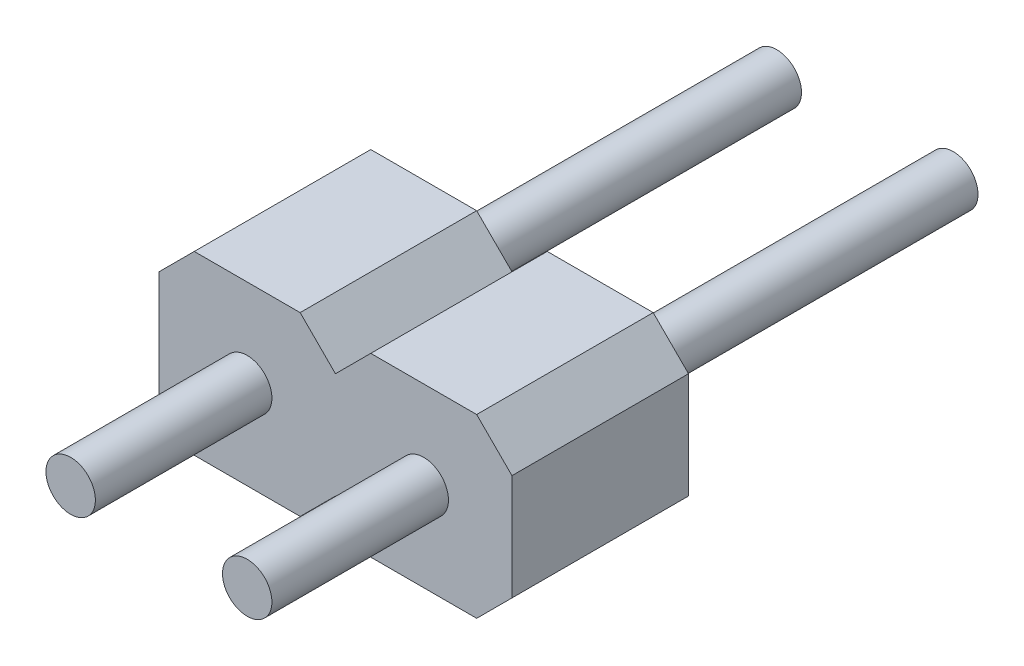
ISO-10303-21;
HEADER;
FILE_DESCRIPTION(('STEP AP214'),'2;1');
FILE_NAME('part.step','',(''),(''),'','','');
FILE_SCHEMA(('AUTOMOTIVE_DESIGN { 1 0 10303 214 1 1 1 1 }'));
ENDSEC;
DATA;
#1=APPLICATION_CONTEXT('core data for automotive mechanical design processes');
#2=APPLICATION_PROTOCOL_DEFINITION('international standard','automotive_design',2000,#1);
#3=PRODUCT_CONTEXT('',#1,'mechanical');
#4=PRODUCT('Part','Part','',(#3));
#5=PRODUCT_RELATED_PRODUCT_CATEGORY('part','',(#4));
#6=PRODUCT_DEFINITION_FORMATION('','',#4);
#7=PRODUCT_DEFINITION_CONTEXT('part definition',#1,'design');
#8=PRODUCT_DEFINITION('design','',#6,#7);
#9=PRODUCT_DEFINITION_SHAPE('','',#8);
#10=(LENGTH_UNIT() NAMED_UNIT(*) SI_UNIT(.MILLI.,.METRE.));
#11=(NAMED_UNIT(*) PLANE_ANGLE_UNIT() SI_UNIT($,.RADIAN.));
#12=(NAMED_UNIT(*) SI_UNIT($,.STERADIAN.) SOLID_ANGLE_UNIT());
#13=UNCERTAINTY_MEASURE_WITH_UNIT(LENGTH_MEASURE(1.E-05),#10,'distance_accuracy_value','');
#14=(GEOMETRIC_REPRESENTATION_CONTEXT(3) GLOBAL_UNCERTAINTY_ASSIGNED_CONTEXT((#13)) GLOBAL_UNIT_ASSIGNED_CONTEXT((#10,
#11,#12)) REPRESENTATION_CONTEXT('',''));
#15=CARTESIAN_POINT('',(0.,0.,0.));
#16=DIRECTION('',(0.,0.,1.));
#17=DIRECTION('',(1.,0.,0.));
#18=AXIS2_PLACEMENT_3D('',#15,#16,#17);
#19=CARTESIAN_POINT('',(11.25,0.75,2.5));
#20=DIRECTION('',(-1.,0.,0.));
#21=DIRECTION('',(0.,0.,1.));
#22=AXIS2_PLACEMENT_3D('',#19,#20,#21);
#23=PLANE('',#22);
#24=DIRECTION('',(0.,0.,1.));
#25=VECTOR('',#24,1.);
#26=CARTESIAN_POINT('',(11.25,0.750000000000001,2.5));
#27=LINE('',#26,#25);
#28=CARTESIAN_POINT('',(11.25,0.75,0.));
#29=VERTEX_POINT('',#28);
#30=CARTESIAN_POINT('',(11.25,0.75,2.5));
#31=VERTEX_POINT('',#30);
#32=EDGE_CURVE('E132',#29,#31,#27,.T.);
#33=ORIENTED_EDGE('',*,*,#32,.T.);
#34=DIRECTION('',(0.,1.,0.));
#35=VECTOR('',#34,1.);
#36=CARTESIAN_POINT('',(11.25,0.75,2.5));
#37=LINE('',#36,#35);
#38=CARTESIAN_POINT('',(11.25,-0.75,2.5));
#39=VERTEX_POINT('',#38);
#40=EDGE_CURVE('E119',#39,#31,#37,.T.);
#41=ORIENTED_EDGE('',*,*,#40,.F.);
#42=DIRECTION('',(0.,0.,1.));
#43=VECTOR('',#42,1.);
#44=CARTESIAN_POINT('',(11.25,-0.750000000000001,2.5));
#45=LINE('',#44,#43);
#46=CARTESIAN_POINT('',(11.25,-0.75,0.));
#47=VERTEX_POINT('',#46);
#48=EDGE_CURVE('E241',#39,#47,#45,.F.);
#49=ORIENTED_EDGE('',*,*,#48,.T.);
#50=DIRECTION('',(0.,1.,0.));
#51=VECTOR('',#50,1.);
#52=CARTESIAN_POINT('',(11.25,0.75,0.));
#53=LINE('',#52,#51);
#54=EDGE_CURVE('E115',#29,#47,#53,.F.);
#55=ORIENTED_EDGE('',*,*,#54,.F.);
#56=EDGE_LOOP('',(#33,#41,#49,#55));
#57=FACE_BOUND('',#56,.T.);
#58=ADVANCED_FACE('F17',(#57),#23,.F.);
#59=CARTESIAN_POINT('',(10.75,1.25,2.5));
#60=DIRECTION('',(-0.707106781186548,-0.707106781186548,0.));
#61=DIRECTION('',(0.707106781186548,-0.707106781186548,0.));
#62=AXIS2_PLACEMENT_3D('',#59,#60,#61);
#63=PLANE('',#62);
#64=DIRECTION('',(0.,0.,-1.));
#65=VECTOR('',#64,1.);
#66=CARTESIAN_POINT('',(10.75,1.25,2.5));
#67=LINE('',#66,#65);
#68=CARTESIAN_POINT('',(10.75,1.25,0.));
#69=VERTEX_POINT('',#68);
#70=CARTESIAN_POINT('',(10.75,1.25,2.5));
#71=VERTEX_POINT('',#70);
#72=EDGE_CURVE('E135',#69,#71,#67,.F.);
#73=ORIENTED_EDGE('',*,*,#72,.T.);
#74=DIRECTION('',(0.707106781186548,-0.707106781186548,0.));
#75=VECTOR('',#74,1.);
#76=CARTESIAN_POINT('',(10.75,1.25,2.5));
#77=LINE('',#76,#75);
#78=EDGE_CURVE('E123',#31,#71,#77,.F.);
#79=ORIENTED_EDGE('',*,*,#78,.F.);
#80=ORIENTED_EDGE('',*,*,#32,.F.);
#81=DIRECTION('',(0.707106781186548,-0.707106781186548,0.));
#82=VECTOR('',#81,1.);
#83=CARTESIAN_POINT('',(10.75,1.25,0.));
#84=LINE('',#83,#82);
#85=EDGE_CURVE('E136',#69,#29,#84,.T.);
#86=ORIENTED_EDGE('',*,*,#85,.F.);
#87=EDGE_LOOP('',(#73,#79,#80,#86));
#88=FACE_BOUND('',#87,.T.);
#89=ADVANCED_FACE('F131',(#88),#63,.F.);
#90=CARTESIAN_POINT('',(10.75,-1.25,2.5));
#91=DIRECTION('',(-0.707106781186548,0.707106781186548,0.));
#92=DIRECTION('',(-0.707106781186548,-0.707106781186548,0.));
#93=AXIS2_PLACEMENT_3D('',#90,#91,#92);
#94=PLANE('',#93);
#95=ORIENTED_EDGE('',*,*,#48,.F.);
#96=DIRECTION('',(-0.707106781186548,-0.707106781186548,0.));
#97=VECTOR('',#96,1.);
#98=CARTESIAN_POINT('',(10.75,-1.25,2.5));
#99=LINE('',#98,#97);
#100=CARTESIAN_POINT('',(10.75,-1.25,2.5));
#101=VERTEX_POINT('',#100);
#102=EDGE_CURVE('E126',#101,#39,#99,.F.);
#103=ORIENTED_EDGE('',*,*,#102,.F.);
#104=DIRECTION('',(0.,0.,1.));
#105=VECTOR('',#104,1.);
#106=CARTESIAN_POINT('',(10.75,-1.25,2.5));
#107=LINE('',#106,#105);
#108=CARTESIAN_POINT('',(10.75,-1.25,0.));
#109=VERTEX_POINT('',#108);
#110=EDGE_CURVE('E228',#101,#109,#107,.F.);
#111=ORIENTED_EDGE('',*,*,#110,.T.);
#112=DIRECTION('',(-0.707106781186548,-0.707106781186548,0.));
#113=VECTOR('',#112,1.);
#114=CARTESIAN_POINT('',(10.75,-1.25,0.));
#115=LINE('',#114,#113);
#116=EDGE_CURVE('E239',#47,#109,#115,.T.);
#117=ORIENTED_EDGE('',*,*,#116,.F.);
#118=EDGE_LOOP('',(#95,#103,#111,#117));
#119=FACE_BOUND('',#118,.T.);
#120=ADVANCED_FACE('F301',(#119),#94,.F.);
#121=CARTESIAN_POINT('',(9.25,1.25,2.5));
#122=DIRECTION('',(0.,-1.,0.));
#123=DIRECTION('',(0.,0.,-1.));
#124=AXIS2_PLACEMENT_3D('',#121,#122,#123);
#125=PLANE('',#124);
#126=DIRECTION('',(0.,0.,1.));
#127=VECTOR('',#126,1.);
#128=CARTESIAN_POINT('',(9.25,1.25,2.5));
#129=LINE('',#128,#127);
#130=CARTESIAN_POINT('',(9.25,1.25,0.));
#131=VERTEX_POINT('',#130);
#132=CARTESIAN_POINT('',(9.25,1.25,2.5));
#133=VERTEX_POINT('',#132);
#134=EDGE_CURVE('E223',#131,#133,#129,.T.);
#135=ORIENTED_EDGE('',*,*,#134,.T.);
#136=DIRECTION('',(1.,0.,0.));
#137=VECTOR('',#136,1.);
#138=CARTESIAN_POINT('',(9.25,1.25,2.5));
#139=LINE('',#138,#137);
#140=EDGE_CURVE('E236',#71,#133,#139,.F.);
#141=ORIENTED_EDGE('',*,*,#140,.F.);
#142=ORIENTED_EDGE('',*,*,#72,.F.);
#143=DIRECTION('',(1.,0.,0.));
#144=VECTOR('',#143,1.);
#145=CARTESIAN_POINT('',(9.25,1.25,0.));
#146=LINE('',#145,#144);
#147=EDGE_CURVE('E233',#131,#69,#146,.T.);
#148=ORIENTED_EDGE('',*,*,#147,.F.);
#149=EDGE_LOOP('',(#135,#141,#142,#148));
#150=FACE_BOUND('',#149,.T.);
#151=ADVANCED_FACE('F247',(#150),#125,.F.);
#152=CARTESIAN_POINT('',(9.25,-1.25,2.5));
#153=DIRECTION('',(0.,1.,0.));
#154=DIRECTION('',(0.,0.,1.));
#155=AXIS2_PLACEMENT_3D('',#152,#153,#154);
#156=PLANE('',#155);
#157=ORIENTED_EDGE('',*,*,#110,.F.);
#158=DIRECTION('',(1.,0.,0.));
#159=VECTOR('',#158,1.);
#160=CARTESIAN_POINT('',(9.25,-1.25,2.5));
#161=LINE('',#160,#159);
#162=CARTESIAN_POINT('',(9.25,-1.25,2.5));
#163=VERTEX_POINT('',#162);
#164=EDGE_CURVE('E231',#163,#101,#161,.T.);
#165=ORIENTED_EDGE('',*,*,#164,.F.);
#166=DIRECTION('',(0.,0.,1.));
#167=VECTOR('',#166,1.);
#168=CARTESIAN_POINT('',(9.25,-1.25,2.5));
#169=LINE('',#168,#167);
#170=CARTESIAN_POINT('',(9.25,-1.25,0.));
#171=VERTEX_POINT('',#170);
#172=EDGE_CURVE('E212',#163,#171,#169,.F.);
#173=ORIENTED_EDGE('',*,*,#172,.T.);
#174=DIRECTION('',(1.,0.,0.));
#175=VECTOR('',#174,1.);
#176=CARTESIAN_POINT('',(9.25,-1.25,0.));
#177=LINE('',#176,#175);
#178=EDGE_CURVE('E226',#109,#171,#177,.F.);
#179=ORIENTED_EDGE('',*,*,#178,.F.);
#180=EDGE_LOOP('',(#157,#165,#173,#179));
#181=FACE_BOUND('',#180,.T.);
#182=ADVANCED_FACE('F298',(#181),#156,.F.);
#183=CARTESIAN_POINT('',(8.75,0.75,2.5));
#184=DIRECTION('',(0.707106781186548,-0.707106781186548,0.));
#185=DIRECTION('',(0.707106781186548,0.707106781186548,0.));
#186=AXIS2_PLACEMENT_3D('',#183,#184,#185);
#187=PLANE('',#186);
#188=DIRECTION('',(0.,0.,1.));
#189=VECTOR('',#188,1.);
#190=CARTESIAN_POINT('',(8.75,0.75,2.5));
#191=LINE('',#190,#189);
#192=CARTESIAN_POINT('',(8.75,0.75,0.));
#193=VERTEX_POINT('',#192);
#194=CARTESIAN_POINT('',(8.75,0.75,2.5));
#195=VERTEX_POINT('',#194);
#196=EDGE_CURVE('E207',#193,#195,#191,.T.);
#197=ORIENTED_EDGE('',*,*,#196,.T.);
#198=DIRECTION('',(0.707106781186548,0.707106781186548,0.));
#199=VECTOR('',#198,1.);
#200=CARTESIAN_POINT('',(8.75,0.75,2.5));
#201=LINE('',#200,#199);
#202=EDGE_CURVE('E221',#133,#195,#201,.F.);
#203=ORIENTED_EDGE('',*,*,#202,.F.);
#204=ORIENTED_EDGE('',*,*,#134,.F.);
#205=DIRECTION('',(0.707106781186548,0.707106781186548,0.));
#206=VECTOR('',#205,1.);
#207=CARTESIAN_POINT('',(8.75,0.75,0.));
#208=LINE('',#207,#206);
#209=EDGE_CURVE('E218',#193,#131,#208,.T.);
#210=ORIENTED_EDGE('',*,*,#209,.F.);
#211=EDGE_LOOP('',(#197,#203,#204,#210));
#212=FACE_BOUND('',#211,.T.);
#213=ADVANCED_FACE('F252',(#212),#187,.F.);
#214=CARTESIAN_POINT('',(8.75,-0.75,2.5));
#215=DIRECTION('',(0.707106781186548,0.707106781186548,0.));
#216=DIRECTION('',(-0.707106781186548,0.707106781186548,0.));
#217=AXIS2_PLACEMENT_3D('',#214,#215,#216);
#218=PLANE('',#217);
#219=ORIENTED_EDGE('',*,*,#172,.F.);
#220=DIRECTION('',(-0.707106781186548,0.707106781186548,0.));
#221=VECTOR('',#220,1.);
#222=CARTESIAN_POINT('',(8.75,-0.75,2.5));
#223=LINE('',#222,#221);
#224=CARTESIAN_POINT('',(8.75,-0.75,2.5));
#225=VERTEX_POINT('',#224);
#226=EDGE_CURVE('E215',#225,#163,#223,.F.);
#227=ORIENTED_EDGE('',*,*,#226,.F.);
#228=DIRECTION('',(0.,0.,1.));
#229=VECTOR('',#228,1.);
#230=CARTESIAN_POINT('',(8.75,-0.75,2.5));
#231=LINE('',#230,#229);
#232=CARTESIAN_POINT('',(8.75,-0.75,0.));
#233=VERTEX_POINT('',#232);
#234=EDGE_CURVE('E196',#225,#233,#231,.F.);
#235=ORIENTED_EDGE('',*,*,#234,.T.);
#236=DIRECTION('',(-0.707106781186548,0.707106781186548,0.));
#237=VECTOR('',#236,1.);
#238=CARTESIAN_POINT('',(8.75,-0.75,0.));
#239=LINE('',#238,#237);
#240=EDGE_CURVE('E210',#171,#233,#239,.T.);
#241=ORIENTED_EDGE('',*,*,#240,.F.);
#242=EDGE_LOOP('',(#219,#227,#235,#241));
#243=FACE_BOUND('',#242,.T.);
#244=ADVANCED_FACE('F295',(#243),#218,.F.);
#245=CARTESIAN_POINT('',(8.25,1.25,2.5));
#246=DIRECTION('',(-0.707106781186548,-0.707106781186548,0.));
#247=DIRECTION('',(0.707106781186548,-0.707106781186548,0.));
#248=AXIS2_PLACEMENT_3D('',#245,#246,#247);
#249=PLANE('',#248);
#250=DIRECTION('',(0.,0.,1.));
#251=VECTOR('',#250,1.);
#252=CARTESIAN_POINT('',(8.25,1.25,2.5));
#253=LINE('',#252,#251);
#254=CARTESIAN_POINT('',(8.25,1.25,0.));
#255=VERTEX_POINT('',#254);
#256=CARTESIAN_POINT('',(8.25,1.25,2.5));
#257=VERTEX_POINT('',#256);
#258=EDGE_CURVE('E191',#255,#257,#253,.T.);
#259=ORIENTED_EDGE('',*,*,#258,.T.);
#260=DIRECTION('',(0.707106781186548,-0.707106781186548,0.));
#261=VECTOR('',#260,1.);
#262=CARTESIAN_POINT('',(8.25,1.25,2.5));
#263=LINE('',#262,#261);
#264=EDGE_CURVE('E205',#195,#257,#263,.F.);
#265=ORIENTED_EDGE('',*,*,#264,.F.);
#266=ORIENTED_EDGE('',*,*,#196,.F.);
#267=DIRECTION('',(0.707106781186548,-0.707106781186548,0.));
#268=VECTOR('',#267,1.);
#269=CARTESIAN_POINT('',(8.25,1.25,0.));
#270=LINE('',#269,#268);
#271=EDGE_CURVE('E202',#255,#193,#270,.T.);
#272=ORIENTED_EDGE('',*,*,#271,.F.);
#273=EDGE_LOOP('',(#259,#265,#266,#272));
#274=FACE_BOUND('',#273,.T.);
#275=ADVANCED_FACE('F255',(#274),#249,.F.);
#276=CARTESIAN_POINT('',(8.25,-1.25,2.5));
#277=DIRECTION('',(-0.707106781186548,0.707106781186548,0.));
#278=DIRECTION('',(-0.707106781186548,-0.707106781186548,0.));
#279=AXIS2_PLACEMENT_3D('',#276,#277,#278);
#280=PLANE('',#279);
#281=ORIENTED_EDGE('',*,*,#234,.F.);
#282=DIRECTION('',(-0.707106781186548,-0.707106781186548,0.));
#283=VECTOR('',#282,1.);
#284=CARTESIAN_POINT('',(8.25,-1.25,2.5));
#285=LINE('',#284,#283);
#286=CARTESIAN_POINT('',(8.25,-1.25,2.5));
#287=VERTEX_POINT('',#286);
#288=EDGE_CURVE('E199',#287,#225,#285,.F.);
#289=ORIENTED_EDGE('',*,*,#288,.F.);
#290=DIRECTION('',(0.,0.,1.));
#291=VECTOR('',#290,1.);
#292=CARTESIAN_POINT('',(8.25,-1.25,2.5));
#293=LINE('',#292,#291);
#294=CARTESIAN_POINT('',(8.25,-1.25,0.));
#295=VERTEX_POINT('',#294);
#296=EDGE_CURVE('E174',#287,#295,#293,.F.);
#297=ORIENTED_EDGE('',*,*,#296,.T.);
#298=DIRECTION('',(-0.707106781186548,-0.707106781186548,0.));
#299=VECTOR('',#298,1.);
#300=CARTESIAN_POINT('',(8.25,-1.25,0.));
#301=LINE('',#300,#299);
#302=EDGE_CURVE('E194',#233,#295,#301,.T.);
#303=ORIENTED_EDGE('',*,*,#302,.F.);
#304=EDGE_LOOP('',(#281,#289,#297,#303));
#305=FACE_BOUND('',#304,.T.);
#306=ADVANCED_FACE('F291',(#305),#280,.F.);
#307=CARTESIAN_POINT('',(10.,0.,-5.));
#308=DIRECTION('',(0.,0.,1.));
#309=DIRECTION('',(1.,0.,0.));
#310=AXIS2_PLACEMENT_3D('',#307,#308,#309);
#311=PLANE('',#310);
#312=CARTESIAN_POINT('',(10.,0.,-5.));
#313=DIRECTION('',(0.,0.,1.));
#314=DIRECTION('',(1.,0.,0.));
#315=AXIS2_PLACEMENT_3D('',#312,#313,#314);
#316=CIRCLE('',#315,0.35);
#317=CARTESIAN_POINT('',(10.35,0.,-5.));
#318=VERTEX_POINT('',#317);
#319=EDGE_CURVE('E20',#318,#318,#316,.T.);
#320=ORIENTED_EDGE('',*,*,#319,.F.);
#321=EDGE_LOOP('',(#320));
#322=FACE_BOUND('',#321,.T.);
#323=ADVANCED_FACE('F354',(#322),#311,.F.);
#324=CARTESIAN_POINT('',(7.5,0.,-5.));
#325=DIRECTION('',(0.,0.,1.));
#326=DIRECTION('',(1.,0.,0.));
#327=AXIS2_PLACEMENT_3D('',#324,#325,#326);
#328=PLANE('',#327);
#329=CARTESIAN_POINT('',(7.5,0.,-5.));
#330=DIRECTION('',(0.,0.,1.));
#331=DIRECTION('',(1.,0.,0.));
#332=AXIS2_PLACEMENT_3D('',#329,#330,#331);
#333=CIRCLE('',#332,0.35);
#334=CARTESIAN_POINT('',(7.85,0.,-5.));
#335=VERTEX_POINT('',#334);
#336=EDGE_CURVE('E163',#335,#335,#333,.T.);
#337=ORIENTED_EDGE('',*,*,#336,.F.);
#338=EDGE_LOOP('',(#337));
#339=FACE_BOUND('',#338,.T.);
#340=ADVANCED_FACE('F351',(#339),#328,.F.);
#341=CARTESIAN_POINT('',(6.75,1.25,2.5));
#342=DIRECTION('',(0.,-1.,0.));
#343=DIRECTION('',(1.,0.,0.));
#344=AXIS2_PLACEMENT_3D('',#341,#342,#343);
#345=PLANE('',#344);
#346=DIRECTION('',(0.,0.,1.));
#347=VECTOR('',#346,1.);
#348=CARTESIAN_POINT('',(6.75,1.25,2.5));
#349=LINE('',#348,#347);
#350=CARTESIAN_POINT('',(6.75,1.25,0.));
#351=VERTEX_POINT('',#350);
#352=CARTESIAN_POINT('',(6.75,1.25,2.5));
#353=VERTEX_POINT('',#352);
#354=EDGE_CURVE('E165',#351,#353,#349,.T.);
#355=ORIENTED_EDGE('',*,*,#354,.T.);
#356=DIRECTION('',(1.,0.,0.));
#357=VECTOR('',#356,1.);
#358=CARTESIAN_POINT('',(6.75,1.25,2.5));
#359=LINE('',#358,#357);
#360=EDGE_CURVE('E189',#257,#353,#359,.F.);
#361=ORIENTED_EDGE('',*,*,#360,.F.);
#362=ORIENTED_EDGE('',*,*,#258,.F.);
#363=DIRECTION('',(1.,0.,0.));
#364=VECTOR('',#363,1.);
#365=CARTESIAN_POINT('',(6.75,1.25,0.));
#366=LINE('',#365,#364);
#367=EDGE_CURVE('E186',#351,#255,#366,.T.);
#368=ORIENTED_EDGE('',*,*,#367,.F.);
#369=EDGE_LOOP('',(#355,#361,#362,#368));
#370=FACE_BOUND('',#369,.T.);
#371=ADVANCED_FACE('F262',(#370),#345,.F.);
#372=CARTESIAN_POINT('',(6.75,-1.25,2.5));
#373=DIRECTION('',(0.,1.,0.));
#374=DIRECTION('',(-1.,0.,0.));
#375=AXIS2_PLACEMENT_3D('',#372,#373,#374);
#376=PLANE('',#375);
#377=ORIENTED_EDGE('',*,*,#296,.F.);
#378=DIRECTION('',(-1.,0.,0.));
#379=VECTOR('',#378,1.);
#380=CARTESIAN_POINT('',(6.75,-1.25,2.5));
#381=LINE('',#380,#379);
#382=CARTESIAN_POINT('',(6.75,-1.25,2.5));
#383=VERTEX_POINT('',#382);
#384=EDGE_CURVE('E180',#383,#287,#381,.F.);
#385=ORIENTED_EDGE('',*,*,#384,.F.);
#386=DIRECTION('',(0.,0.,1.));
#387=VECTOR('',#386,1.);
#388=CARTESIAN_POINT('',(6.75,-1.25,2.5));
#389=LINE('',#388,#387);
#390=CARTESIAN_POINT('',(6.75,-1.25,0.));
#391=VERTEX_POINT('',#390);
#392=EDGE_CURVE('E162',#383,#391,#389,.F.);
#393=ORIENTED_EDGE('',*,*,#392,.T.);
#394=DIRECTION('',(-1.,0.,0.));
#395=VECTOR('',#394,1.);
#396=CARTESIAN_POINT('',(6.75,-1.25,0.));
#397=LINE('',#396,#395);
#398=EDGE_CURVE('E171',#295,#391,#397,.T.);
#399=ORIENTED_EDGE('',*,*,#398,.F.);
#400=EDGE_LOOP('',(#377,#385,#393,#399));
#401=FACE_BOUND('',#400,.T.);
#402=ADVANCED_FACE('F287',(#401),#376,.F.);
#403=CARTESIAN_POINT('',(10.,0.,-5.));
#404=DIRECTION('',(0.,0.,1.));
#405=DIRECTION('',(1.,0.,0.));
#406=AXIS2_PLACEMENT_3D('',#403,#404,#405);
#407=CYLINDRICAL_SURFACE('',#406,0.35);
#408=CARTESIAN_POINT('',(10.,0.,0.));
#409=DIRECTION('',(0.,0.,1.));
#410=DIRECTION('',(1.,0.,0.));
#411=AXIS2_PLACEMENT_3D('',#408,#409,#410);
#412=CIRCLE('',#411,0.35);
#413=CARTESIAN_POINT('',(10.35,0.,0.));
#414=VERTEX_POINT('',#413);
#415=EDGE_CURVE('E160',#414,#414,#412,.T.);
#416=ORIENTED_EDGE('',*,*,#415,.F.);
#417=EDGE_LOOP('',(#416));
#418=FACE_BOUND('',#417,.T.);
#419=ORIENTED_EDGE('',*,*,#319,.T.);
#420=EDGE_LOOP('',(#419));
#421=FACE_BOUND('',#420,.T.);
#422=ADVANCED_FACE('F342',(#418,#421),#407,.T.);
#423=CARTESIAN_POINT('',(7.5,0.,-5.));
#424=DIRECTION('',(0.,0.,1.));
#425=DIRECTION('',(1.,0.,0.));
#426=AXIS2_PLACEMENT_3D('',#423,#424,#425);
#427=CYLINDRICAL_SURFACE('',#426,0.35);
#428=CARTESIAN_POINT('',(7.5,0.,0.));
#429=DIRECTION('',(0.,0.,1.));
#430=DIRECTION('',(1.,0.,0.));
#431=AXIS2_PLACEMENT_3D('',#428,#429,#430);
#432=CIRCLE('',#431,0.35);
#433=CARTESIAN_POINT('',(7.85,0.,0.));
#434=VERTEX_POINT('',#433);
#435=EDGE_CURVE('E156',#434,#434,#432,.T.);
#436=ORIENTED_EDGE('',*,*,#435,.F.);
#437=EDGE_LOOP('',(#436));
#438=FACE_BOUND('',#437,.T.);
#439=ORIENTED_EDGE('',*,*,#336,.T.);
#440=EDGE_LOOP('',(#439));
#441=FACE_BOUND('',#440,.T.);
#442=ADVANCED_FACE('F338',(#438,#441),#427,.T.);
#443=CARTESIAN_POINT('',(10.,0.,5.));
#444=DIRECTION('',(0.,0.,1.));
#445=DIRECTION('',(1.,0.,0.));
#446=AXIS2_PLACEMENT_3D('',#443,#444,#445);
#447=PLANE('',#446);
#448=CARTESIAN_POINT('',(10.,0.,5.));
#449=DIRECTION('',(0.,0.,1.));
#450=DIRECTION('',(1.,0.,0.));
#451=AXIS2_PLACEMENT_3D('',#448,#449,#450);
#452=CIRCLE('',#451,0.35);
#453=CARTESIAN_POINT('',(10.35,0.,5.));
#454=VERTEX_POINT('',#453);
#455=EDGE_CURVE('E152',#454,#454,#452,.F.);
#456=ORIENTED_EDGE('',*,*,#455,.F.);
#457=EDGE_LOOP('',(#456));
#458=FACE_BOUND('',#457,.T.);
#459=ADVANCED_FACE('F334',(#458),#447,.T.);
#460=CARTESIAN_POINT('',(7.5,0.,5.));
#461=DIRECTION('',(0.,0.,1.));
#462=DIRECTION('',(1.,0.,0.));
#463=AXIS2_PLACEMENT_3D('',#460,#461,#462);
#464=PLANE('',#463);
#465=CARTESIAN_POINT('',(7.5,0.,5.));
#466=DIRECTION('',(0.,0.,1.));
#467=DIRECTION('',(1.,0.,0.));
#468=AXIS2_PLACEMENT_3D('',#465,#466,#467);
#469=CIRCLE('',#468,0.35);
#470=CARTESIAN_POINT('',(7.85,0.,5.));
#471=VERTEX_POINT('',#470);
#472=EDGE_CURVE('E148',#471,#471,#469,.F.);
#473=ORIENTED_EDGE('',*,*,#472,.F.);
#474=EDGE_LOOP('',(#473));
#475=FACE_BOUND('',#474,.T.);
#476=ADVANCED_FACE('F331',(#475),#464,.T.);
#477=CARTESIAN_POINT('',(6.25,0.75,2.5));
#478=DIRECTION('',(0.707106781186548,-0.707106781186548,0.));
#479=DIRECTION('',(0.707106781186548,0.707106781186548,0.));
#480=AXIS2_PLACEMENT_3D('',#477,#478,#479);
#481=PLANE('',#480);
#482=DIRECTION('',(0.,0.,-1.));
#483=VECTOR('',#482,1.);
#484=CARTESIAN_POINT('',(6.25,0.75,2.5));
#485=LINE('',#484,#483);
#486=CARTESIAN_POINT('',(6.25,0.75,0.));
#487=VERTEX_POINT('',#486);
#488=CARTESIAN_POINT('',(6.25,0.75,2.5));
#489=VERTEX_POINT('',#488);
#490=EDGE_CURVE('E151',#487,#489,#485,.F.);
#491=ORIENTED_EDGE('',*,*,#490,.T.);
#492=DIRECTION('',(0.707106781186548,0.707106781186548,0.));
#493=VECTOR('',#492,1.);
#494=CARTESIAN_POINT('',(6.25,0.75,2.5));
#495=LINE('',#494,#493);
#496=EDGE_CURVE('E35',#353,#489,#495,.F.);
#497=ORIENTED_EDGE('',*,*,#496,.F.);
#498=ORIENTED_EDGE('',*,*,#354,.F.);
#499=DIRECTION('',(0.707106781186547,0.707106781186548,0.));
#500=VECTOR('',#499,1.);
#501=CARTESIAN_POINT('',(6.25,0.75,0.));
#502=LINE('',#501,#500);
#503=EDGE_CURVE('E159',#487,#351,#502,.T.);
#504=ORIENTED_EDGE('',*,*,#503,.F.);
#505=EDGE_LOOP('',(#491,#497,#498,#504));
#506=FACE_BOUND('',#505,.T.);
#507=ADVANCED_FACE('F265',(#506),#481,.F.);
#508=CARTESIAN_POINT('',(6.25,-0.75,2.5));
#509=DIRECTION('',(0.707106781186548,0.707106781186548,0.));
#510=DIRECTION('',(-0.707106781186548,0.707106781186548,0.));
#511=AXIS2_PLACEMENT_3D('',#508,#509,#510);
#512=PLANE('',#511);
#513=ORIENTED_EDGE('',*,*,#392,.F.);
#514=DIRECTION('',(-0.707106781186548,0.707106781186548,0.));
#515=VECTOR('',#514,1.);
#516=CARTESIAN_POINT('',(6.25,-0.75,2.5));
#517=LINE('',#516,#515);
#518=CARTESIAN_POINT('',(6.25,-0.75,2.5));
#519=VERTEX_POINT('',#518);
#520=EDGE_CURVE('E266',#519,#383,#517,.F.);
#521=ORIENTED_EDGE('',*,*,#520,.F.);
#522=DIRECTION('',(0.,0.,-1.));
#523=VECTOR('',#522,1.);
#524=CARTESIAN_POINT('',(6.25,-0.75,2.5));
#525=LINE('',#524,#523);
#526=CARTESIAN_POINT('',(6.25,-0.75,0.));
#527=VERTEX_POINT('',#526);
#528=EDGE_CURVE('E274',#519,#527,#525,.T.);
#529=ORIENTED_EDGE('',*,*,#528,.T.);
#530=DIRECTION('',(-0.707106781186547,0.707106781186548,0.));
#531=VECTOR('',#530,1.);
#532=CARTESIAN_POINT('',(6.75,-1.25,0.));
#533=LINE('',#532,#531);
#534=EDGE_CURVE('E155',#391,#527,#533,.T.);
#535=ORIENTED_EDGE('',*,*,#534,.F.);
#536=EDGE_LOOP('',(#513,#521,#529,#535));
#537=FACE_BOUND('',#536,.T.);
#538=ADVANCED_FACE('F284',(#537),#512,.F.);
#539=CARTESIAN_POINT('',(0.,0.,0.));
#540=DIRECTION('',(0.,0.,-1.));
#541=DIRECTION('',(-1.,0.,0.));
#542=AXIS2_PLACEMENT_3D('',#539,#540,#541);
#543=PLANE('',#542);
#544=ORIENTED_EDGE('',*,*,#534,.T.);
#545=DIRECTION('',(0.,1.,0.));
#546=VECTOR('',#545,1.);
#547=CARTESIAN_POINT('',(6.25,0.75,0.));
#548=LINE('',#547,#546);
#549=EDGE_CURVE('E147',#527,#487,#548,.T.);
#550=ORIENTED_EDGE('',*,*,#549,.T.);
#551=ORIENTED_EDGE('',*,*,#503,.T.);
#552=ORIENTED_EDGE('',*,*,#367,.T.);
#553=ORIENTED_EDGE('',*,*,#271,.T.);
#554=ORIENTED_EDGE('',*,*,#209,.T.);
#555=ORIENTED_EDGE('',*,*,#147,.T.);
#556=ORIENTED_EDGE('',*,*,#85,.T.);
#557=ORIENTED_EDGE('',*,*,#54,.T.);
#558=ORIENTED_EDGE('',*,*,#116,.T.);
#559=ORIENTED_EDGE('',*,*,#178,.T.);
#560=ORIENTED_EDGE('',*,*,#240,.T.);
#561=ORIENTED_EDGE('',*,*,#302,.T.);
#562=ORIENTED_EDGE('',*,*,#398,.T.);
#563=EDGE_LOOP('',(#544,#550,#551,#552,#553,#554,#555,#556,#557,#558,#559,#560,#561,#562));
#564=FACE_BOUND('',#563,.T.);
#565=ORIENTED_EDGE('',*,*,#435,.T.);
#566=EDGE_LOOP('',(#565));
#567=FACE_BOUND('',#566,.T.);
#568=ORIENTED_EDGE('',*,*,#415,.T.);
#569=EDGE_LOOP('',(#568));
#570=FACE_BOUND('',#569,.T.);
#571=ADVANCED_FACE('F243',(#564,#567,#570),#543,.T.);
#572=CARTESIAN_POINT('',(10.,0.,-5.));
#573=DIRECTION('',(0.,0.,1.));
#574=DIRECTION('',(1.,0.,0.));
#575=AXIS2_PLACEMENT_3D('',#572,#573,#574);
#576=CYLINDRICAL_SURFACE('',#575,0.35);
#577=CARTESIAN_POINT('',(10.,0.,2.5));
#578=DIRECTION('',(0.,0.,1.));
#579=DIRECTION('',(1.,0.,0.));
#580=AXIS2_PLACEMENT_3D('',#577,#578,#579);
#581=CIRCLE('',#580,0.35);
#582=CARTESIAN_POINT('',(10.35,0.,2.5));
#583=VERTEX_POINT('',#582);
#584=EDGE_CURVE('E144',#583,#583,#581,.T.);
#585=ORIENTED_EDGE('',*,*,#584,.T.);
#586=EDGE_LOOP('',(#585));
#587=FACE_BOUND('',#586,.T.);
#588=ORIENTED_EDGE('',*,*,#455,.T.);
#589=EDGE_LOOP('',(#588));
#590=FACE_BOUND('',#589,.T.);
#591=ADVANCED_FACE('F320',(#587,#590),#576,.T.);
#592=CARTESIAN_POINT('',(7.5,0.,-5.));
#593=DIRECTION('',(0.,0.,1.));
#594=DIRECTION('',(1.,0.,0.));
#595=AXIS2_PLACEMENT_3D('',#592,#593,#594);
#596=CYLINDRICAL_SURFACE('',#595,0.35);
#597=CARTESIAN_POINT('',(7.5,0.,2.5));
#598=DIRECTION('',(0.,0.,1.));
#599=DIRECTION('',(1.,0.,0.));
#600=AXIS2_PLACEMENT_3D('',#597,#598,#599);
#601=CIRCLE('',#600,0.35);
#602=CARTESIAN_POINT('',(7.85,0.,2.5));
#603=VERTEX_POINT('',#602);
#604=EDGE_CURVE('E26',#603,#603,#601,.T.);
#605=ORIENTED_EDGE('',*,*,#604,.T.);
#606=EDGE_LOOP('',(#605));
#607=FACE_BOUND('',#606,.T.);
#608=ORIENTED_EDGE('',*,*,#472,.T.);
#609=EDGE_LOOP('',(#608));
#610=FACE_BOUND('',#609,.T.);
#611=ADVANCED_FACE('F315',(#607,#610),#596,.T.);
#612=CARTESIAN_POINT('',(6.25,0.75,2.5));
#613=DIRECTION('',(1.,0.,0.));
#614=DIRECTION('',(0.,0.,-1.));
#615=AXIS2_PLACEMENT_3D('',#612,#613,#614);
#616=PLANE('',#615);
#617=ORIENTED_EDGE('',*,*,#528,.F.);
#618=DIRECTION('',(0.,1.,0.));
#619=VECTOR('',#618,1.);
#620=CARTESIAN_POINT('',(6.25,0.,2.5));
#621=LINE('',#620,#619);
#622=EDGE_CURVE('E11',#519,#489,#621,.T.);
#623=ORIENTED_EDGE('',*,*,#622,.T.);
#624=ORIENTED_EDGE('',*,*,#490,.F.);
#625=ORIENTED_EDGE('',*,*,#549,.F.);
#626=EDGE_LOOP('',(#617,#623,#624,#625));
#627=FACE_BOUND('',#626,.T.);
#628=ADVANCED_FACE('F281',(#627),#616,.F.);
#629=CARTESIAN_POINT('',(0.,0.,2.5));
#630=DIRECTION('',(0.,0.,-1.));
#631=DIRECTION('',(-1.,0.,0.));
#632=AXIS2_PLACEMENT_3D('',#629,#630,#631);
#633=PLANE('',#632);
#634=ORIENTED_EDGE('',*,*,#622,.F.);
#635=ORIENTED_EDGE('',*,*,#520,.T.);
#636=ORIENTED_EDGE('',*,*,#384,.T.);
#637=ORIENTED_EDGE('',*,*,#288,.T.);
#638=ORIENTED_EDGE('',*,*,#226,.T.);
#639=ORIENTED_EDGE('',*,*,#164,.T.);
#640=ORIENTED_EDGE('',*,*,#102,.T.);
#641=ORIENTED_EDGE('',*,*,#40,.T.);
#642=ORIENTED_EDGE('',*,*,#78,.T.);
#643=ORIENTED_EDGE('',*,*,#140,.T.);
#644=ORIENTED_EDGE('',*,*,#202,.T.);
#645=ORIENTED_EDGE('',*,*,#264,.T.);
#646=ORIENTED_EDGE('',*,*,#360,.T.);
#647=ORIENTED_EDGE('',*,*,#496,.T.);
#648=EDGE_LOOP('',(#634,#635,#636,#637,#638,#639,#640,#641,#642,#643,#644,#645,#646,#647));
#649=FACE_BOUND('',#648,.T.);
#650=ORIENTED_EDGE('',*,*,#604,.F.);
#651=EDGE_LOOP('',(#650));
#652=FACE_BOUND('',#651,.T.);
#653=ORIENTED_EDGE('',*,*,#584,.F.);
#654=EDGE_LOOP('',(#653));
#655=FACE_BOUND('',#654,.T.);
#656=ADVANCED_FACE('F121',(#649,#652,#655),#633,.F.);
#657=CLOSED_SHELL('',(#58,#89,#120,#151,#182,#213,#244,#275,#306,#323,#340,#371,#402,#422,#442,
#459,#476,#507,#538,#571,#591,#611,#628,#656));
#658=MANIFOLD_SOLID_BREP('B1',#657);
#659=ADVANCED_BREP_SHAPE_REPRESENTATION('',(#18,#658),#14);
#660=SHAPE_DEFINITION_REPRESENTATION(#9,#659);
ENDSEC;
END-ISO-10303-21;
